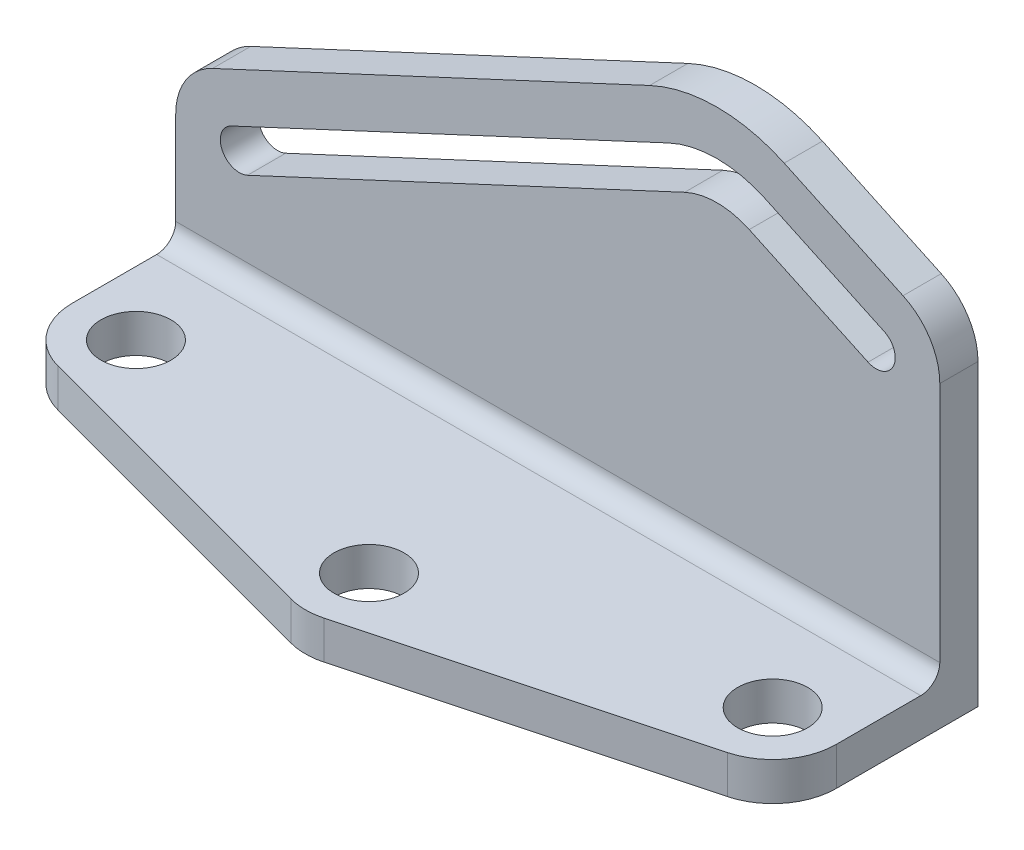
ISO-10303-21;
HEADER;
FILE_DESCRIPTION(('STEP AP214'),'2;1');
FILE_NAME('part.step','',(''),(''),'','','');
FILE_SCHEMA(('AUTOMOTIVE_DESIGN { 1 0 10303 214 1 1 1 1 }'));
ENDSEC;
DATA;
#1=APPLICATION_CONTEXT('core data for automotive mechanical design processes');
#2=APPLICATION_PROTOCOL_DEFINITION('international standard','automotive_design',2000,#1);
#3=PRODUCT_CONTEXT('',#1,'mechanical');
#4=PRODUCT('Part','Part','',(#3));
#5=PRODUCT_RELATED_PRODUCT_CATEGORY('part','',(#4));
#6=PRODUCT_DEFINITION_FORMATION('','',#4);
#7=PRODUCT_DEFINITION_CONTEXT('part definition',#1,'design');
#8=PRODUCT_DEFINITION('design','',#6,#7);
#9=PRODUCT_DEFINITION_SHAPE('','',#8);
#10=(LENGTH_UNIT() NAMED_UNIT(*) SI_UNIT(.MILLI.,.METRE.));
#11=(NAMED_UNIT(*) PLANE_ANGLE_UNIT() SI_UNIT($,.RADIAN.));
#12=(NAMED_UNIT(*) SI_UNIT($,.STERADIAN.) SOLID_ANGLE_UNIT());
#13=UNCERTAINTY_MEASURE_WITH_UNIT(LENGTH_MEASURE(1.E-05),#10,'distance_accuracy_value','');
#14=(GEOMETRIC_REPRESENTATION_CONTEXT(3) GLOBAL_UNCERTAINTY_ASSIGNED_CONTEXT((#13)) GLOBAL_UNIT_ASSIGNED_CONTEXT((#10,
#11,#12)) REPRESENTATION_CONTEXT('',''));
#15=CARTESIAN_POINT('',(0.,0.,0.));
#16=DIRECTION('',(0.,0.,1.));
#17=DIRECTION('',(1.,0.,0.));
#18=AXIS2_PLACEMENT_3D('',#15,#16,#17);
#19=CARTESIAN_POINT('',(60.,0.,6.));
#20=DIRECTION('',(0.,1.,0.));
#21=DIRECTION('',(0.,0.,1.));
#22=AXIS2_PLACEMENT_3D('',#19,#20,#21);
#23=PLANE('',#22);
#24=DIRECTION('',(1.,0.,0.));
#25=VECTOR('',#24,1.);
#26=CARTESIAN_POINT('',(60.,0.,0.));
#27=LINE('',#26,#25);
#28=CARTESIAN_POINT('',(-60.,0.,0.));
#29=VERTEX_POINT('',#28);
#30=CARTESIAN_POINT('',(60.,0.,0.));
#31=VERTEX_POINT('',#30);
#32=EDGE_CURVE('E314',#29,#31,#27,.T.);
#33=ORIENTED_EDGE('',*,*,#32,.T.);
#34=DIRECTION('',(0.,0.,-1.));
#35=VECTOR('',#34,1.);
#36=CARTESIAN_POINT('',(60.,0.,6.));
#37=LINE('',#36,#35);
#38=CARTESIAN_POINT('',(60.,0.,22.249778574343));
#39=VERTEX_POINT('',#38);
#40=EDGE_CURVE('E377',#39,#31,#37,.T.);
#41=ORIENTED_EDGE('',*,*,#40,.F.);
#42=CARTESIAN_POINT('',(50.,0.,22.249778574343));
#43=DIRECTION('',(0.,-1.,0.));
#44=DIRECTION('',(0.,0.,1.));
#45=AXIS2_PLACEMENT_3D('',#42,#43,#44);
#46=CIRCLE('',#45,9.99999999999999);
#47=CARTESIAN_POINT('',(52.5881904510252,0.,31.9090368372337));
#48=VERTEX_POINT('',#47);
#49=EDGE_CURVE('E273',#39,#48,#46,.T.);
#50=ORIENTED_EDGE('',*,*,#49,.T.);
#51=DIRECTION('',(-0.965925826289068,0.,0.258819045102522));
#52=VECTOR('',#51,1.);
#53=CARTESIAN_POINT('',(2.58819045102522,0.,45.3064964587899));
#54=LINE('',#53,#52);
#55=CARTESIAN_POINT('',(2.58819045102522,0.,45.3064964587899));
#56=VERTEX_POINT('',#55);
#57=EDGE_CURVE('E300',#48,#56,#54,.T.);
#58=ORIENTED_EDGE('',*,*,#57,.T.);
#59=CARTESIAN_POINT('',(0.,0.,35.6472381958992));
#60=DIRECTION('',(0.,-1.,0.));
#61=DIRECTION('',(0.,0.,1.));
#62=AXIS2_PLACEMENT_3D('',#59,#60,#61);
#63=CIRCLE('',#62,10.);
#64=CARTESIAN_POINT('',(-2.58819045102521,0.,45.3064964587899));
#65=VERTEX_POINT('',#64);
#66=EDGE_CURVE('E303',#56,#65,#63,.T.);
#67=ORIENTED_EDGE('',*,*,#66,.T.);
#68=DIRECTION('',(-0.965925826289068,0.,-0.258819045102521));
#69=VECTOR('',#68,1.);
#70=CARTESIAN_POINT('',(-52.5881904510252,0.,31.9090368372337));
#71=LINE('',#70,#69);
#72=CARTESIAN_POINT('',(-52.5881904510252,0.,31.9090368372337));
#73=VERTEX_POINT('',#72);
#74=EDGE_CURVE('E306',#65,#73,#71,.T.);
#75=ORIENTED_EDGE('',*,*,#74,.T.);
#76=CARTESIAN_POINT('',(-50.,0.,22.249778574343));
#77=DIRECTION('',(0.,-1.,0.));
#78=DIRECTION('',(0.,0.,1.));
#79=AXIS2_PLACEMENT_3D('',#76,#77,#78);
#80=CIRCLE('',#79,10.);
#81=CARTESIAN_POINT('',(-60.,0.,22.249778574343));
#82=VERTEX_POINT('',#81);
#83=EDGE_CURVE('E280',#73,#82,#80,.T.);
#84=ORIENTED_EDGE('',*,*,#83,.T.);
#85=DIRECTION('',(0.,0.,-1.));
#86=VECTOR('',#85,1.);
#87=CARTESIAN_POINT('',(-60.,0.,6.));
#88=LINE('',#87,#86);
#89=EDGE_CURVE('E341',#82,#29,#88,.T.);
#90=ORIENTED_EDGE('',*,*,#89,.T.);
#91=EDGE_LOOP('',(#33,#41,#50,#58,#67,#75,#84,#90));
#92=FACE_BOUND('',#91,.T.);
#93=CARTESIAN_POINT('',(50.,0.,22.249778574343));
#94=DIRECTION('',(0.,-1.,0.));
#95=DIRECTION('',(0.,0.,-1.));
#96=AXIS2_PLACEMENT_3D('',#93,#94,#95);
#97=CIRCLE('',#96,5.5);
#98=CARTESIAN_POINT('',(50.,0.,16.749778574343));
#99=VERTEX_POINT('',#98);
#100=EDGE_CURVE('E246',#99,#99,#97,.T.);
#101=ORIENTED_EDGE('',*,*,#100,.F.);
#102=EDGE_LOOP('',(#101));
#103=FACE_BOUND('',#102,.T.);
#104=CARTESIAN_POINT('',(0.,0.,35.6472381958992));
#105=DIRECTION('',(0.,-1.,0.));
#106=DIRECTION('',(0.,0.,-1.));
#107=AXIS2_PLACEMENT_3D('',#104,#105,#106);
#108=CIRCLE('',#107,5.50000000000001);
#109=CARTESIAN_POINT('',(0.,0.,30.1472381958992));
#110=VERTEX_POINT('',#109);
#111=EDGE_CURVE('E261',#110,#110,#108,.T.);
#112=ORIENTED_EDGE('',*,*,#111,.F.);
#113=EDGE_LOOP('',(#112));
#114=FACE_BOUND('',#113,.T.);
#115=CARTESIAN_POINT('',(-50.,0.,22.249778574343));
#116=DIRECTION('',(0.,-1.,0.));
#117=DIRECTION('',(0.,0.,-1.));
#118=AXIS2_PLACEMENT_3D('',#115,#116,#117);
#119=CIRCLE('',#118,5.5);
#120=CARTESIAN_POINT('',(-50.,0.,16.749778574343));
#121=VERTEX_POINT('',#120);
#122=EDGE_CURVE('E267',#121,#121,#119,.T.);
#123=ORIENTED_EDGE('',*,*,#122,.F.);
#124=EDGE_LOOP('',(#123));
#125=FACE_BOUND('',#124,.T.);
#126=ADVANCED_FACE('F35',(#92,#103,#114,#125),#23,.F.);
#127=CARTESIAN_POINT('',(60.,46.9446802996746,6.));
#128=DIRECTION('',(-1.,0.,0.));
#129=DIRECTION('',(0.,-1.,0.));
#130=AXIS2_PLACEMENT_3D('',#127,#128,#129);
#131=PLANE('',#130);
#132=DIRECTION('',(0.,1.,0.));
#133=VECTOR('',#132,1.);
#134=CARTESIAN_POINT('',(60.,46.9446802996746,0.));
#135=LINE('',#134,#133);
#136=CARTESIAN_POINT('',(60.,46.9446802996746,0.));
#137=VERTEX_POINT('',#136);
#138=EDGE_CURVE('E344',#31,#137,#135,.T.);
#139=ORIENTED_EDGE('',*,*,#138,.T.);
#140=DIRECTION('',(0.,0.,-1.));
#141=VECTOR('',#140,1.);
#142=CARTESIAN_POINT('',(60.,46.9446802996746,6.));
#143=LINE('',#142,#141);
#144=CARTESIAN_POINT('',(60.,46.9446802996746,6.));
#145=VERTEX_POINT('',#144);
#146=EDGE_CURVE('E374',#145,#137,#143,.T.);
#147=ORIENTED_EDGE('',*,*,#146,.F.);
#148=DIRECTION('',(0.,1.,0.));
#149=VECTOR('',#148,1.);
#150=CARTESIAN_POINT('',(60.,46.9446802996746,6.));
#151=LINE('',#150,#149);
#152=CARTESIAN_POINT('',(60.,9.,6.));
#153=VERTEX_POINT('',#152);
#154=EDGE_CURVE('E325',#153,#145,#151,.T.);
#155=ORIENTED_EDGE('',*,*,#154,.F.);
#156=CARTESIAN_POINT('',(60.,9.,9.));
#157=DIRECTION('',(-1.,0.,0.));
#158=DIRECTION('',(0.,-1.,0.));
#159=AXIS2_PLACEMENT_3D('',#156,#157,#158);
#160=CIRCLE('',#159,3.);
#161=CARTESIAN_POINT('',(60.,6.,9.));
#162=VERTEX_POINT('',#161);
#163=EDGE_CURVE('E43',#153,#162,#160,.T.);
#164=ORIENTED_EDGE('',*,*,#163,.T.);
#165=DIRECTION('',(0.,0.,1.));
#166=VECTOR('',#165,1.);
#167=CARTESIAN_POINT('',(60.,6.,22.249778574343));
#168=LINE('',#167,#166);
#169=CARTESIAN_POINT('',(60.,6.,22.249778574343));
#170=VERTEX_POINT('',#169);
#171=EDGE_CURVE('E279',#162,#170,#168,.T.);
#172=ORIENTED_EDGE('',*,*,#171,.T.);
#173=DIRECTION('',(0.,-1.,0.));
#174=VECTOR('',#173,1.);
#175=CARTESIAN_POINT('',(60.,6.,22.249778574343));
#176=LINE('',#175,#174);
#177=EDGE_CURVE('E297',#170,#39,#176,.T.);
#178=ORIENTED_EDGE('',*,*,#177,.T.);
#179=ORIENTED_EDGE('',*,*,#40,.T.);
#180=EDGE_LOOP('',(#139,#147,#155,#164,#172,#178,#179));
#181=FACE_BOUND('',#180,.T.);
#182=ADVANCED_FACE('F387',(#181),#131,.F.);
#183=CARTESIAN_POINT('',(50.,46.9446802996746,6.));
#184=DIRECTION('',(0.,0.,-1.));
#185=DIRECTION('',(-1.,0.,0.));
#186=AXIS2_PLACEMENT_3D('',#183,#184,#185);
#187=CYLINDRICAL_SURFACE('',#186,9.99999999999999);
#188=CARTESIAN_POINT('',(50.,46.9446802996746,0.));
#189=DIRECTION('',(0.,0.,1.));
#190=DIRECTION('',(-1.,0.,0.));
#191=AXIS2_PLACEMENT_3D('',#188,#189,#190);
#192=CIRCLE('',#191,9.99999999999999);
#193=CARTESIAN_POINT('',(54.226182617407,56.007758170041,0.));
#194=VERTEX_POINT('',#193);
#195=EDGE_CURVE('E346',#137,#194,#192,.T.);
#196=ORIENTED_EDGE('',*,*,#195,.T.);
#197=DIRECTION('',(0.,0.,-1.));
#198=VECTOR('',#197,1.);
#199=CARTESIAN_POINT('',(54.226182617407,56.007758170041,6.));
#200=LINE('',#199,#198);
#201=CARTESIAN_POINT('',(54.226182617407,56.007758170041,6.));
#202=VERTEX_POINT('',#201);
#203=EDGE_CURVE('E371',#202,#194,#200,.T.);
#204=ORIENTED_EDGE('',*,*,#203,.F.);
#205=CARTESIAN_POINT('',(50.,46.9446802996746,6.));
#206=DIRECTION('',(0.,0.,1.));
#207=DIRECTION('',(-1.,0.,0.));
#208=AXIS2_PLACEMENT_3D('',#205,#206,#207);
#209=CIRCLE('',#208,9.99999999999999);
#210=EDGE_CURVE('E327',#145,#202,#209,.T.);
#211=ORIENTED_EDGE('',*,*,#210,.F.);
#212=ORIENTED_EDGE('',*,*,#146,.T.);
#213=EDGE_LOOP('',(#196,#204,#211,#212));
#214=FACE_BOUND('',#213,.T.);
#215=ADVANCED_FACE('F436',(#214),#187,.T.);
#216=CARTESIAN_POINT('',(35.5654565435175,64.7093976450285,6.));
#217=DIRECTION('',(-0.422618261740703,-0.906307787036648,0.));
#218=DIRECTION('',(0.906307787036648,-0.422618261740704,0.));
#219=AXIS2_PLACEMENT_3D('',#216,#217,#218);
#220=PLANE('',#219);
#221=DIRECTION('',(-0.906307787036648,0.422618261740704,0.));
#222=VECTOR('',#221,1.);
#223=CARTESIAN_POINT('',(35.5654565435175,64.7093976450285,0.));
#224=LINE('',#223,#222);
#225=CARTESIAN_POINT('',(35.5654565435175,64.7093976450285,0.));
#226=VERTEX_POINT('',#225);
#227=EDGE_CURVE('E348',#194,#226,#224,.T.);
#228=ORIENTED_EDGE('',*,*,#227,.T.);
#229=DIRECTION('',(0.,0.,-1.));
#230=VECTOR('',#229,1.);
#231=CARTESIAN_POINT('',(35.5654565435175,64.7093976450285,6.));
#232=LINE('',#231,#230);
#233=CARTESIAN_POINT('',(35.5654565435175,64.7093976450285,6.));
#234=VERTEX_POINT('',#233);
#235=EDGE_CURVE('E368',#234,#226,#232,.T.);
#236=ORIENTED_EDGE('',*,*,#235,.F.);
#237=DIRECTION('',(-0.906307787036648,0.422618261740704,0.));
#238=VECTOR('',#237,1.);
#239=CARTESIAN_POINT('',(35.5654565435175,64.7093976450285,6.));
#240=LINE('',#239,#238);
#241=EDGE_CURVE('E330',#202,#234,#240,.T.);
#242=ORIENTED_EDGE('',*,*,#241,.F.);
#243=ORIENTED_EDGE('',*,*,#203,.T.);
#244=EDGE_LOOP('',(#228,#236,#242,#243));
#245=FACE_BOUND('',#244,.T.);
#246=ADVANCED_FACE('F442',(#245),#220,.F.);
#247=CARTESIAN_POINT('',(24.9999999999999,42.0517029691123,6.));
#248=DIRECTION('',(0.,0.,-1.));
#249=DIRECTION('',(-1.,0.,0.));
#250=AXIS2_PLACEMENT_3D('',#247,#248,#249);
#251=CYLINDRICAL_SURFACE('',#250,25.);
#252=CARTESIAN_POINT('',(24.9999999999999,42.0517029691123,0.));
#253=DIRECTION('',(0.,0.,1.));
#254=DIRECTION('',(-1.,0.,0.));
#255=AXIS2_PLACEMENT_3D('',#252,#253,#254);
#256=CIRCLE('',#255,25.);
#257=CARTESIAN_POINT('',(14.4345434564825,64.7093976450285,0.));
#258=VERTEX_POINT('',#257);
#259=EDGE_CURVE('E350',#226,#258,#256,.T.);
#260=ORIENTED_EDGE('',*,*,#259,.T.);
#261=DIRECTION('',(0.,0.,-1.));
#262=VECTOR('',#261,1.);
#263=CARTESIAN_POINT('',(14.4345434564825,64.7093976450285,6.));
#264=LINE('',#263,#262);
#265=CARTESIAN_POINT('',(14.4345434564825,64.7093976450285,6.));
#266=VERTEX_POINT('',#265);
#267=EDGE_CURVE('E365',#266,#258,#264,.T.);
#268=ORIENTED_EDGE('',*,*,#267,.F.);
#269=CARTESIAN_POINT('',(24.9999999999999,42.0517029691123,6.));
#270=DIRECTION('',(0.,0.,1.));
#271=DIRECTION('',(-1.,0.,0.));
#272=AXIS2_PLACEMENT_3D('',#269,#270,#271);
#273=CIRCLE('',#272,25.);
#274=EDGE_CURVE('E332',#234,#266,#273,.T.);
#275=ORIENTED_EDGE('',*,*,#274,.F.);
#276=ORIENTED_EDGE('',*,*,#235,.T.);
#277=EDGE_LOOP('',(#260,#268,#275,#276));
#278=FACE_BOUND('',#277,.T.);
#279=ADVANCED_FACE('F446',(#278),#251,.T.);
#280=CARTESIAN_POINT('',(-54.226182617407,32.6923752622915,6.));
#281=DIRECTION('',(0.422618261740697,-0.906307787036651,0.));
#282=DIRECTION('',(0.906307787036651,0.422618261740697,0.));
#283=AXIS2_PLACEMENT_3D('',#280,#281,#282);
#284=PLANE('',#283);
#285=DIRECTION('',(-0.906307787036651,-0.422618261740697,0.));
#286=VECTOR('',#285,1.);
#287=CARTESIAN_POINT('',(-54.226182617407,32.6923752622915,0.));
#288=LINE('',#287,#286);
#289=CARTESIAN_POINT('',(-54.226182617407,32.6923752622915,0.));
#290=VERTEX_POINT('',#289);
#291=EDGE_CURVE('E352',#258,#290,#288,.T.);
#292=ORIENTED_EDGE('',*,*,#291,.T.);
#293=DIRECTION('',(0.,0.,-1.));
#294=VECTOR('',#293,1.);
#295=CARTESIAN_POINT('',(-54.226182617407,32.6923752622915,6.));
#296=LINE('',#295,#294);
#297=CARTESIAN_POINT('',(-54.226182617407,32.6923752622915,6.));
#298=VERTEX_POINT('',#297);
#299=EDGE_CURVE('E362',#298,#290,#296,.T.);
#300=ORIENTED_EDGE('',*,*,#299,.F.);
#301=DIRECTION('',(-0.906307787036651,-0.422618261740697,0.));
#302=VECTOR('',#301,1.);
#303=CARTESIAN_POINT('',(-54.226182617407,32.6923752622915,6.));
#304=LINE('',#303,#302);
#305=EDGE_CURVE('E334',#266,#298,#304,.T.);
#306=ORIENTED_EDGE('',*,*,#305,.F.);
#307=ORIENTED_EDGE('',*,*,#267,.T.);
#308=EDGE_LOOP('',(#292,#300,#306,#307));
#309=FACE_BOUND('',#308,.T.);
#310=ADVANCED_FACE('F449',(#309),#284,.F.);
#311=CARTESIAN_POINT('',(-50.,23.629297391925,6.));
#312=DIRECTION('',(0.,0.,-1.));
#313=DIRECTION('',(-1.,0.,0.));
#314=AXIS2_PLACEMENT_3D('',#311,#312,#313);
#315=CYLINDRICAL_SURFACE('',#314,10.);
#316=CARTESIAN_POINT('',(-50.,23.629297391925,0.));
#317=DIRECTION('',(0.,0.,1.));
#318=DIRECTION('',(-1.,0.,0.));
#319=AXIS2_PLACEMENT_3D('',#316,#317,#318);
#320=CIRCLE('',#319,10.);
#321=CARTESIAN_POINT('',(-60.,23.629297391925,0.));
#322=VERTEX_POINT('',#321);
#323=EDGE_CURVE('E354',#290,#322,#320,.T.);
#324=ORIENTED_EDGE('',*,*,#323,.T.);
#325=DIRECTION('',(0.,0.,-1.));
#326=VECTOR('',#325,1.);
#327=CARTESIAN_POINT('',(-60.,23.629297391925,6.));
#328=LINE('',#327,#326);
#329=CARTESIAN_POINT('',(-60.,23.629297391925,6.));
#330=VERTEX_POINT('',#329);
#331=EDGE_CURVE('E359',#330,#322,#328,.T.);
#332=ORIENTED_EDGE('',*,*,#331,.F.);
#333=CARTESIAN_POINT('',(-50.,23.629297391925,6.));
#334=DIRECTION('',(0.,0.,1.));
#335=DIRECTION('',(-1.,0.,0.));
#336=AXIS2_PLACEMENT_3D('',#333,#334,#335);
#337=CIRCLE('',#336,10.);
#338=EDGE_CURVE('E336',#298,#330,#337,.T.);
#339=ORIENTED_EDGE('',*,*,#338,.F.);
#340=ORIENTED_EDGE('',*,*,#299,.T.);
#341=EDGE_LOOP('',(#324,#332,#339,#340));
#342=FACE_BOUND('',#341,.T.);
#343=ADVANCED_FACE('F409',(#342),#315,.T.);
#344=CARTESIAN_POINT('',(-60.,0.,6.));
#345=DIRECTION('',(1.,0.,0.));
#346=DIRECTION('',(0.,0.,-1.));
#347=AXIS2_PLACEMENT_3D('',#344,#345,#346);
#348=PLANE('',#347);
#349=DIRECTION('',(0.,-1.,0.));
#350=VECTOR('',#349,1.);
#351=CARTESIAN_POINT('',(-60.,0.,0.));
#352=LINE('',#351,#350);
#353=EDGE_CURVE('E328',#322,#29,#352,.T.);
#354=ORIENTED_EDGE('',*,*,#353,.T.);
#355=ORIENTED_EDGE('',*,*,#89,.F.);
#356=DIRECTION('',(0.,-1.,0.));
#357=VECTOR('',#356,1.);
#358=CARTESIAN_POINT('',(-60.,6.,22.249778574343));
#359=LINE('',#358,#357);
#360=CARTESIAN_POINT('',(-60.,6.,22.249778574343));
#361=VERTEX_POINT('',#360);
#362=EDGE_CURVE('E311',#361,#82,#359,.T.);
#363=ORIENTED_EDGE('',*,*,#362,.F.);
#364=DIRECTION('',(0.,0.,-1.));
#365=VECTOR('',#364,1.);
#366=CARTESIAN_POINT('',(-60.,6.,6.));
#367=LINE('',#366,#365);
#368=CARTESIAN_POINT('',(-60.,6.,9.));
#369=VERTEX_POINT('',#368);
#370=EDGE_CURVE('E276',#361,#369,#367,.T.);
#371=ORIENTED_EDGE('',*,*,#370,.T.);
#372=CARTESIAN_POINT('',(-60.,9.,9.));
#373=DIRECTION('',(1.,0.,0.));
#374=DIRECTION('',(0.,0.,-1.));
#375=AXIS2_PLACEMENT_3D('',#372,#373,#374);
#376=CIRCLE('',#375,3.);
#377=CARTESIAN_POINT('',(-60.,9.,6.));
#378=VERTEX_POINT('',#377);
#379=EDGE_CURVE('E11',#369,#378,#376,.T.);
#380=ORIENTED_EDGE('',*,*,#379,.T.);
#381=DIRECTION('',(0.,-1.,0.));
#382=VECTOR('',#381,1.);
#383=CARTESIAN_POINT('',(-60.,0.,6.));
#384=LINE('',#383,#382);
#385=EDGE_CURVE('E338',#330,#378,#384,.T.);
#386=ORIENTED_EDGE('',*,*,#385,.F.);
#387=ORIENTED_EDGE('',*,*,#331,.T.);
#388=EDGE_LOOP('',(#354,#355,#363,#371,#380,#386,#387));
#389=FACE_BOUND('',#388,.T.);
#390=ADVANCED_FACE('F401',(#389),#348,.F.);
#391=CARTESIAN_POINT('',(-50.,23.629297391925,6.));
#392=DIRECTION('',(0.,0.,-1.));
#393=DIRECTION('',(-1.,0.,0.));
#394=AXIS2_PLACEMENT_3D('',#391,#392,#393);
#395=PLANE('',#394);
#396=DIRECTION('',(-0.906307787036648,0.422618261740703,0.));
#397=VECTOR('',#396,1.);
#398=CARTESIAN_POINT('',(51.2678547852221,49.6636036607845,6.));
#399=LINE('',#398,#397);
#400=CARTESIAN_POINT('',(51.2678547852221,49.6636036607845,6.));
#401=VERTEX_POINT('',#400);
#402=CARTESIAN_POINT('',(32.6071287113325,58.3652431357719,6.));
#403=VERTEX_POINT('',#402);
#404=EDGE_CURVE('E228',#401,#403,#399,.T.);
#405=ORIENTED_EDGE('',*,*,#404,.F.);
#406=CARTESIAN_POINT('',(50.,46.9446802996745,6.));
#407=DIRECTION('',(0.,0.,1.));
#408=DIRECTION('',(-1.,0.,0.));
#409=AXIS2_PLACEMENT_3D('',#406,#407,#408);
#410=CIRCLE('',#409,3.);
#411=CARTESIAN_POINT('',(48.7321452147779,44.2257569385646,6.));
#412=VERTEX_POINT('',#411);
#413=EDGE_CURVE('E50',#412,#401,#410,.T.);
#414=ORIENTED_EDGE('',*,*,#413,.F.);
#415=DIRECTION('',(0.906307787036648,-0.422618261740703,0.));
#416=VECTOR('',#415,1.);
#417=CARTESIAN_POINT('',(48.7321452147779,44.2257569385646,6.));
#418=LINE('',#417,#416);
#419=CARTESIAN_POINT('',(30.0714191408883,52.9273964135521,6.));
#420=VERTEX_POINT('',#419);
#421=EDGE_CURVE('E208',#420,#412,#418,.T.);
#422=ORIENTED_EDGE('',*,*,#421,.F.);
#423=CARTESIAN_POINT('',(24.9999999999999,42.0517029691123,6.));
#424=DIRECTION('',(0.,0.,-1.));
#425=DIRECTION('',(1.,0.,0.));
#426=AXIS2_PLACEMENT_3D('',#423,#424,#425);
#427=CIRCLE('',#426,12.);
#428=CARTESIAN_POINT('',(19.9285808591115,52.9273964135521,6.));
#429=VERTEX_POINT('',#428);
#430=EDGE_CURVE('E211',#429,#420,#427,.T.);
#431=ORIENTED_EDGE('',*,*,#430,.F.);
#432=DIRECTION('',(0.906307787036651,0.422618261740697,0.));
#433=VECTOR('',#432,1.);
#434=CARTESIAN_POINT('',(19.9285808591115,52.9273964135521,6.));
#435=LINE('',#434,#433);
#436=CARTESIAN_POINT('',(-48.7321452147779,20.9103740308151,6.));
#437=VERTEX_POINT('',#436);
#438=EDGE_CURVE('E239',#437,#429,#435,.T.);
#439=ORIENTED_EDGE('',*,*,#438,.F.);
#440=CARTESIAN_POINT('',(-50.,23.629297391925,6.));
#441=DIRECTION('',(0.,0.,1.));
#442=DIRECTION('',(1.,0.,0.));
#443=AXIS2_PLACEMENT_3D('',#440,#441,#442);
#444=CIRCLE('',#443,3.);
#445=CARTESIAN_POINT('',(-51.2678547852221,26.348220753035,6.));
#446=VERTEX_POINT('',#445);
#447=EDGE_CURVE('E236',#446,#437,#444,.T.);
#448=ORIENTED_EDGE('',*,*,#447,.F.);
#449=DIRECTION('',(-0.906307787036651,-0.422618261740697,0.));
#450=VECTOR('',#449,1.);
#451=CARTESIAN_POINT('',(17.3928712886673,58.365243135772,6.));
#452=LINE('',#451,#450);
#453=CARTESIAN_POINT('',(17.3928712886673,58.365243135772,6.));
#454=VERTEX_POINT('',#453);
#455=EDGE_CURVE('E233',#454,#446,#452,.T.);
#456=ORIENTED_EDGE('',*,*,#455,.F.);
#457=CARTESIAN_POINT('',(24.9999999999999,42.0517029691123,6.));
#458=DIRECTION('',(0.,0.,1.));
#459=DIRECTION('',(1.,0.,0.));
#460=AXIS2_PLACEMENT_3D('',#457,#458,#459);
#461=CIRCLE('',#460,18.);
#462=EDGE_CURVE('E230',#403,#454,#461,.T.);
#463=ORIENTED_EDGE('',*,*,#462,.F.);
#464=EDGE_LOOP('',(#405,#414,#422,#431,#439,#448,#456,#463));
#465=FACE_BOUND('',#464,.T.);
#466=ORIENTED_EDGE('',*,*,#385,.T.);
#467=DIRECTION('',(1.,0.,0.));
#468=VECTOR('',#467,1.);
#469=CARTESIAN_POINT('',(-50.,9.,6.));
#470=LINE('',#469,#468);
#471=EDGE_CURVE('E380',#378,#153,#470,.T.);
#472=ORIENTED_EDGE('',*,*,#471,.T.);
#473=ORIENTED_EDGE('',*,*,#154,.T.);
#474=ORIENTED_EDGE('',*,*,#210,.T.);
#475=ORIENTED_EDGE('',*,*,#241,.T.);
#476=ORIENTED_EDGE('',*,*,#274,.T.);
#477=ORIENTED_EDGE('',*,*,#305,.T.);
#478=ORIENTED_EDGE('',*,*,#338,.T.);
#479=EDGE_LOOP('',(#466,#472,#473,#474,#475,#476,#477,#478));
#480=FACE_BOUND('',#479,.T.);
#481=ADVANCED_FACE('F403',(#465,#480),#395,.F.);
#482=CARTESIAN_POINT('',(-50.,23.629297391925,0.));
#483=DIRECTION('',(0.,0.,-1.));
#484=DIRECTION('',(-1.,0.,0.));
#485=AXIS2_PLACEMENT_3D('',#482,#483,#484);
#486=PLANE('',#485);
#487=CARTESIAN_POINT('',(50.,46.9446802996745,0.));
#488=DIRECTION('',(0.,0.,1.));
#489=DIRECTION('',(-1.,0.,0.));
#490=AXIS2_PLACEMENT_3D('',#487,#488,#489);
#491=CIRCLE('',#490,3.);
#492=CARTESIAN_POINT('',(48.7321452147779,44.2257569385646,0.));
#493=VERTEX_POINT('',#492);
#494=CARTESIAN_POINT('',(51.2678547852221,49.6636036607845,0.));
#495=VERTEX_POINT('',#494);
#496=EDGE_CURVE('E191',#493,#495,#491,.T.);
#497=ORIENTED_EDGE('',*,*,#496,.T.);
#498=DIRECTION('',(-0.906307787036648,0.422618261740703,0.));
#499=VECTOR('',#498,1.);
#500=CARTESIAN_POINT('',(51.2678547852221,49.6636036607845,0.));
#501=LINE('',#500,#499);
#502=CARTESIAN_POINT('',(32.6071287113325,58.3652431357719,0.));
#503=VERTEX_POINT('',#502);
#504=EDGE_CURVE('E200',#495,#503,#501,.T.);
#505=ORIENTED_EDGE('',*,*,#504,.T.);
#506=CARTESIAN_POINT('',(24.9999999999999,42.0517029691123,0.));
#507=DIRECTION('',(0.,0.,1.));
#508=DIRECTION('',(1.,0.,0.));
#509=AXIS2_PLACEMENT_3D('',#506,#507,#508);
#510=CIRCLE('',#509,18.);
#511=CARTESIAN_POINT('',(17.3928712886673,58.365243135772,0.));
#512=VERTEX_POINT('',#511);
#513=EDGE_CURVE('E58',#503,#512,#510,.T.);
#514=ORIENTED_EDGE('',*,*,#513,.T.);
#515=DIRECTION('',(-0.906307787036651,-0.422618261740697,0.));
#516=VECTOR('',#515,1.);
#517=CARTESIAN_POINT('',(17.3928712886673,58.365243135772,0.));
#518=LINE('',#517,#516);
#519=CARTESIAN_POINT('',(-51.2678547852221,26.348220753035,0.));
#520=VERTEX_POINT('',#519);
#521=EDGE_CURVE('E215',#512,#520,#518,.T.);
#522=ORIENTED_EDGE('',*,*,#521,.T.);
#523=CARTESIAN_POINT('',(-50.,23.629297391925,0.));
#524=DIRECTION('',(0.,0.,1.));
#525=DIRECTION('',(1.,0.,0.));
#526=AXIS2_PLACEMENT_3D('',#523,#524,#525);
#527=CIRCLE('',#526,3.);
#528=CARTESIAN_POINT('',(-48.7321452147779,20.9103740308151,0.));
#529=VERTEX_POINT('',#528);
#530=EDGE_CURVE('E218',#520,#529,#527,.T.);
#531=ORIENTED_EDGE('',*,*,#530,.T.);
#532=DIRECTION('',(0.906307787036651,0.422618261740697,0.));
#533=VECTOR('',#532,1.);
#534=CARTESIAN_POINT('',(19.9285808591115,52.9273964135521,0.));
#535=LINE('',#534,#533);
#536=CARTESIAN_POINT('',(19.9285808591115,52.9273964135521,0.));
#537=VERTEX_POINT('',#536);
#538=EDGE_CURVE('E221',#529,#537,#535,.T.);
#539=ORIENTED_EDGE('',*,*,#538,.T.);
#540=CARTESIAN_POINT('',(24.9999999999999,42.0517029691123,0.));
#541=DIRECTION('',(0.,0.,-1.));
#542=DIRECTION('',(1.,0.,0.));
#543=AXIS2_PLACEMENT_3D('',#540,#541,#542);
#544=CIRCLE('',#543,12.);
#545=CARTESIAN_POINT('',(30.0714191408883,52.9273964135521,0.));
#546=VERTEX_POINT('',#545);
#547=EDGE_CURVE('E224',#537,#546,#544,.T.);
#548=ORIENTED_EDGE('',*,*,#547,.T.);
#549=DIRECTION('',(0.906307787036648,-0.422618261740703,0.));
#550=VECTOR('',#549,1.);
#551=CARTESIAN_POINT('',(48.7321452147779,44.2257569385646,0.));
#552=LINE('',#551,#550);
#553=EDGE_CURVE('E197',#546,#493,#552,.T.);
#554=ORIENTED_EDGE('',*,*,#553,.T.);
#555=EDGE_LOOP('',(#497,#505,#514,#522,#531,#539,#548,#554));
#556=FACE_BOUND('',#555,.T.);
#557=ORIENTED_EDGE('',*,*,#32,.F.);
#558=ORIENTED_EDGE('',*,*,#353,.F.);
#559=ORIENTED_EDGE('',*,*,#323,.F.);
#560=ORIENTED_EDGE('',*,*,#291,.F.);
#561=ORIENTED_EDGE('',*,*,#259,.F.);
#562=ORIENTED_EDGE('',*,*,#227,.F.);
#563=ORIENTED_EDGE('',*,*,#195,.F.);
#564=ORIENTED_EDGE('',*,*,#138,.F.);
#565=EDGE_LOOP('',(#557,#558,#559,#560,#561,#562,#563,#564));
#566=FACE_BOUND('',#565,.T.);
#567=ADVANCED_FACE('F204',(#556,#566),#486,.T.);
#568=CARTESIAN_POINT('',(-50.,6.,22.249778574343));
#569=DIRECTION('',(0.,-1.,0.));
#570=DIRECTION('',(0.,0.,-1.));
#571=AXIS2_PLACEMENT_3D('',#568,#569,#570);
#572=CYLINDRICAL_SURFACE('',#571,10.);
#573=ORIENTED_EDGE('',*,*,#83,.F.);
#574=DIRECTION('',(0.,-1.,0.));
#575=VECTOR('',#574,1.);
#576=CARTESIAN_POINT('',(-52.5881904510252,6.,31.9090368372337));
#577=LINE('',#576,#575);
#578=CARTESIAN_POINT('',(-52.5881904510252,6.,31.9090368372337));
#579=VERTEX_POINT('',#578);
#580=EDGE_CURVE('E315',#579,#73,#577,.T.);
#581=ORIENTED_EDGE('',*,*,#580,.F.);
#582=CARTESIAN_POINT('',(-50.,6.,22.249778574343));
#583=DIRECTION('',(0.,-1.,0.));
#584=DIRECTION('',(0.,0.,1.));
#585=AXIS2_PLACEMENT_3D('',#582,#583,#584);
#586=CIRCLE('',#585,10.);
#587=EDGE_CURVE('E294',#579,#361,#586,.T.);
#588=ORIENTED_EDGE('',*,*,#587,.T.);
#589=ORIENTED_EDGE('',*,*,#362,.T.);
#590=EDGE_LOOP('',(#573,#581,#588,#589));
#591=FACE_BOUND('',#590,.T.);
#592=ADVANCED_FACE('F419',(#591),#572,.T.);
#593=CARTESIAN_POINT('',(-52.5881904510252,6.,31.9090368372337));
#594=DIRECTION('',(-0.258819045102521,0.,0.965925826289068));
#595=DIRECTION('',(0.965925826289068,0.,0.258819045102521));
#596=AXIS2_PLACEMENT_3D('',#593,#594,#595);
#597=PLANE('',#596);
#598=ORIENTED_EDGE('',*,*,#74,.F.);
#599=DIRECTION('',(0.,-1.,0.));
#600=VECTOR('',#599,1.);
#601=CARTESIAN_POINT('',(-2.58819045102521,6.,45.3064964587899));
#602=LINE('',#601,#600);
#603=CARTESIAN_POINT('',(-2.58819045102521,6.,45.3064964587899));
#604=VERTEX_POINT('',#603);
#605=EDGE_CURVE('E317',#604,#65,#602,.T.);
#606=ORIENTED_EDGE('',*,*,#605,.F.);
#607=DIRECTION('',(-0.965925826289068,0.,-0.258819045102521));
#608=VECTOR('',#607,1.);
#609=CARTESIAN_POINT('',(-52.5881904510252,6.,31.9090368372337));
#610=LINE('',#609,#608);
#611=EDGE_CURVE('E291',#604,#579,#610,.T.);
#612=ORIENTED_EDGE('',*,*,#611,.T.);
#613=ORIENTED_EDGE('',*,*,#580,.T.);
#614=EDGE_LOOP('',(#598,#606,#612,#613));
#615=FACE_BOUND('',#614,.T.);
#616=ADVANCED_FACE('F503',(#615),#597,.T.);
#617=CARTESIAN_POINT('',(0.,6.,35.6472381958992));
#618=DIRECTION('',(0.,-1.,0.));
#619=DIRECTION('',(0.,0.,-1.));
#620=AXIS2_PLACEMENT_3D('',#617,#618,#619);
#621=CYLINDRICAL_SURFACE('',#620,10.);
#622=ORIENTED_EDGE('',*,*,#66,.F.);
#623=DIRECTION('',(0.,-1.,0.));
#624=VECTOR('',#623,1.);
#625=CARTESIAN_POINT('',(2.58819045102522,6.,45.3064964587899));
#626=LINE('',#625,#624);
#627=CARTESIAN_POINT('',(2.58819045102522,6.,45.3064964587899));
#628=VERTEX_POINT('',#627);
#629=EDGE_CURVE('E319',#628,#56,#626,.T.);
#630=ORIENTED_EDGE('',*,*,#629,.F.);
#631=CARTESIAN_POINT('',(0.,6.,35.6472381958992));
#632=DIRECTION('',(0.,-1.,0.));
#633=DIRECTION('',(0.,0.,1.));
#634=AXIS2_PLACEMENT_3D('',#631,#632,#633);
#635=CIRCLE('',#634,10.);
#636=EDGE_CURVE('E288',#628,#604,#635,.T.);
#637=ORIENTED_EDGE('',*,*,#636,.T.);
#638=ORIENTED_EDGE('',*,*,#605,.T.);
#639=EDGE_LOOP('',(#622,#630,#637,#638));
#640=FACE_BOUND('',#639,.T.);
#641=ADVANCED_FACE('F426',(#640),#621,.T.);
#642=CARTESIAN_POINT('',(2.58819045102522,6.,45.3064964587899));
#643=DIRECTION('',(0.258819045102522,0.,0.965925826289068));
#644=DIRECTION('',(0.965925826289068,0.,-0.258819045102522));
#645=AXIS2_PLACEMENT_3D('',#642,#643,#644);
#646=PLANE('',#645);
#647=ORIENTED_EDGE('',*,*,#57,.F.);
#648=DIRECTION('',(0.,-1.,0.));
#649=VECTOR('',#648,1.);
#650=CARTESIAN_POINT('',(52.5881904510252,6.,31.9090368372337));
#651=LINE('',#650,#649);
#652=CARTESIAN_POINT('',(52.5881904510252,6.,31.9090368372337));
#653=VERTEX_POINT('',#652);
#654=EDGE_CURVE('E321',#653,#48,#651,.T.);
#655=ORIENTED_EDGE('',*,*,#654,.F.);
#656=DIRECTION('',(-0.965925826289068,0.,0.258819045102522));
#657=VECTOR('',#656,1.);
#658=CARTESIAN_POINT('',(2.58819045102522,6.,45.3064964587899));
#659=LINE('',#658,#657);
#660=EDGE_CURVE('E285',#653,#628,#659,.T.);
#661=ORIENTED_EDGE('',*,*,#660,.T.);
#662=ORIENTED_EDGE('',*,*,#629,.T.);
#663=EDGE_LOOP('',(#647,#655,#661,#662));
#664=FACE_BOUND('',#663,.T.);
#665=ADVANCED_FACE('F430',(#664),#646,.T.);
#666=CARTESIAN_POINT('',(50.,6.,22.249778574343));
#667=DIRECTION('',(0.,-1.,0.));
#668=DIRECTION('',(0.,0.,-1.));
#669=AXIS2_PLACEMENT_3D('',#666,#667,#668);
#670=CYLINDRICAL_SURFACE('',#669,9.99999999999999);
#671=ORIENTED_EDGE('',*,*,#49,.F.);
#672=ORIENTED_EDGE('',*,*,#177,.F.);
#673=CARTESIAN_POINT('',(50.,6.,22.249778574343));
#674=DIRECTION('',(0.,-1.,0.));
#675=DIRECTION('',(0.,0.,1.));
#676=AXIS2_PLACEMENT_3D('',#673,#674,#675);
#677=CIRCLE('',#676,9.99999999999999);
#678=EDGE_CURVE('E282',#170,#653,#677,.T.);
#679=ORIENTED_EDGE('',*,*,#678,.T.);
#680=ORIENTED_EDGE('',*,*,#654,.T.);
#681=EDGE_LOOP('',(#671,#672,#679,#680));
#682=FACE_BOUND('',#681,.T.);
#683=ADVANCED_FACE('F433',(#682),#670,.T.);
#684=CARTESIAN_POINT('',(-50.,6.,22.249778574343));
#685=DIRECTION('',(0.,1.,0.));
#686=DIRECTION('',(0.,0.,1.));
#687=AXIS2_PLACEMENT_3D('',#684,#685,#686);
#688=PLANE('',#687);
#689=CARTESIAN_POINT('',(50.,6.,22.249778574343));
#690=DIRECTION('',(0.,-1.,0.));
#691=DIRECTION('',(0.,0.,-1.));
#692=AXIS2_PLACEMENT_3D('',#689,#690,#691);
#693=CIRCLE('',#692,5.5);
#694=CARTESIAN_POINT('',(50.,6.,16.749778574343));
#695=VERTEX_POINT('',#694);
#696=EDGE_CURVE('E258',#695,#695,#693,.T.);
#697=ORIENTED_EDGE('',*,*,#696,.T.);
#698=EDGE_LOOP('',(#697));
#699=FACE_BOUND('',#698,.T.);
#700=CARTESIAN_POINT('',(0.,6.,35.6472381958992));
#701=DIRECTION('',(0.,-1.,0.));
#702=DIRECTION('',(0.,0.,-1.));
#703=AXIS2_PLACEMENT_3D('',#700,#701,#702);
#704=CIRCLE('',#703,5.50000000000001);
#705=CARTESIAN_POINT('',(0.,6.,30.1472381958992));
#706=VERTEX_POINT('',#705);
#707=EDGE_CURVE('E264',#706,#706,#704,.T.);
#708=ORIENTED_EDGE('',*,*,#707,.T.);
#709=EDGE_LOOP('',(#708));
#710=FACE_BOUND('',#709,.T.);
#711=CARTESIAN_POINT('',(-50.,6.,22.249778574343));
#712=DIRECTION('',(0.,-1.,0.));
#713=DIRECTION('',(0.,0.,-1.));
#714=AXIS2_PLACEMENT_3D('',#711,#712,#713);
#715=CIRCLE('',#714,5.5);
#716=CARTESIAN_POINT('',(-50.,6.,16.749778574343));
#717=VERTEX_POINT('',#716);
#718=EDGE_CURVE('E270',#717,#717,#715,.T.);
#719=ORIENTED_EDGE('',*,*,#718,.T.);
#720=EDGE_LOOP('',(#719));
#721=FACE_BOUND('',#720,.T.);
#722=ORIENTED_EDGE('',*,*,#171,.F.);
#723=DIRECTION('',(1.,0.,0.));
#724=VECTOR('',#723,1.);
#725=CARTESIAN_POINT('',(-50.,6.,9.));
#726=LINE('',#725,#724);
#727=EDGE_CURVE('E383',#162,#369,#726,.F.);
#728=ORIENTED_EDGE('',*,*,#727,.T.);
#729=ORIENTED_EDGE('',*,*,#370,.F.);
#730=ORIENTED_EDGE('',*,*,#587,.F.);
#731=ORIENTED_EDGE('',*,*,#611,.F.);
#732=ORIENTED_EDGE('',*,*,#636,.F.);
#733=ORIENTED_EDGE('',*,*,#660,.F.);
#734=ORIENTED_EDGE('',*,*,#678,.F.);
#735=EDGE_LOOP('',(#722,#728,#729,#730,#731,#732,#733,#734));
#736=FACE_BOUND('',#735,.T.);
#737=ADVANCED_FACE('F395',(#699,#710,#721,#736),#688,.T.);
#738=CARTESIAN_POINT('',(-50.,6.,22.249778574343));
#739=DIRECTION('',(0.,-1.,0.));
#740=DIRECTION('',(0.,0.,-1.));
#741=AXIS2_PLACEMENT_3D('',#738,#739,#740);
#742=CYLINDRICAL_SURFACE('',#741,5.5);
#743=ORIENTED_EDGE('',*,*,#718,.F.);
#744=EDGE_LOOP('',(#743));
#745=FACE_BOUND('',#744,.T.);
#746=ORIENTED_EDGE('',*,*,#122,.T.);
#747=EDGE_LOOP('',(#746));
#748=FACE_BOUND('',#747,.T.);
#749=ADVANCED_FACE('F544',(#745,#748),#742,.F.);
#750=CARTESIAN_POINT('',(0.,6.,35.6472381958992));
#751=DIRECTION('',(0.,-1.,0.));
#752=DIRECTION('',(0.,0.,-1.));
#753=AXIS2_PLACEMENT_3D('',#750,#751,#752);
#754=CYLINDRICAL_SURFACE('',#753,5.50000000000001);
#755=ORIENTED_EDGE('',*,*,#707,.F.);
#756=EDGE_LOOP('',(#755));
#757=FACE_BOUND('',#756,.T.);
#758=ORIENTED_EDGE('',*,*,#111,.T.);
#759=EDGE_LOOP('',(#758));
#760=FACE_BOUND('',#759,.T.);
#761=ADVANCED_FACE('F549',(#757,#760),#754,.F.);
#762=CARTESIAN_POINT('',(50.,6.,22.249778574343));
#763=DIRECTION('',(0.,-1.,0.));
#764=DIRECTION('',(0.,0.,-1.));
#765=AXIS2_PLACEMENT_3D('',#762,#763,#764);
#766=CYLINDRICAL_SURFACE('',#765,5.5);
#767=ORIENTED_EDGE('',*,*,#696,.F.);
#768=EDGE_LOOP('',(#767));
#769=FACE_BOUND('',#768,.T.);
#770=ORIENTED_EDGE('',*,*,#100,.T.);
#771=EDGE_LOOP('',(#770));
#772=FACE_BOUND('',#771,.T.);
#773=ADVANCED_FACE('F559',(#769,#772),#766,.F.);
#774=CARTESIAN_POINT('',(-50.,9.,9.));
#775=DIRECTION('',(1.,0.,0.));
#776=DIRECTION('',(0.,0.,-1.));
#777=AXIS2_PLACEMENT_3D('',#774,#775,#776);
#778=CYLINDRICAL_SURFACE('',#777,3.);
#779=ORIENTED_EDGE('',*,*,#379,.F.);
#780=ORIENTED_EDGE('',*,*,#727,.F.);
#781=ORIENTED_EDGE('',*,*,#163,.F.);
#782=ORIENTED_EDGE('',*,*,#471,.F.);
#783=EDGE_LOOP('',(#779,#780,#781,#782));
#784=FACE_BOUND('',#783,.T.);
#785=ADVANCED_FACE('F37',(#784),#778,.F.);
#786=CARTESIAN_POINT('',(50.,46.9446802996745,0.));
#787=DIRECTION('',(0.,0.,1.));
#788=DIRECTION('',(1.,0.,0.));
#789=AXIS2_PLACEMENT_3D('',#786,#787,#788);
#790=CYLINDRICAL_SURFACE('',#789,3.);
#791=ORIENTED_EDGE('',*,*,#413,.T.);
#792=DIRECTION('',(0.,0.,1.));
#793=VECTOR('',#792,1.);
#794=CARTESIAN_POINT('',(51.2678547852221,49.6636036607845,0.));
#795=LINE('',#794,#793);
#796=EDGE_CURVE('E187',#495,#401,#795,.T.);
#797=ORIENTED_EDGE('',*,*,#796,.F.);
#798=ORIENTED_EDGE('',*,*,#496,.F.);
#799=DIRECTION('',(0.,0.,1.));
#800=VECTOR('',#799,1.);
#801=CARTESIAN_POINT('',(48.7321452147779,44.2257569385646,0.));
#802=LINE('',#801,#800);
#803=EDGE_CURVE('E244',#493,#412,#802,.T.);
#804=ORIENTED_EDGE('',*,*,#803,.T.);
#805=EDGE_LOOP('',(#791,#797,#798,#804));
#806=FACE_BOUND('',#805,.T.);
#807=ADVANCED_FACE('F189',(#806),#790,.F.);
#808=CARTESIAN_POINT('',(48.7321452147779,44.2257569385646,0.));
#809=DIRECTION('',(-0.422618261740703,-0.906307787036648,0.));
#810=DIRECTION('',(0.906307787036648,-0.422618261740703,0.));
#811=AXIS2_PLACEMENT_3D('',#808,#809,#810);
#812=PLANE('',#811);
#813=ORIENTED_EDGE('',*,*,#421,.T.);
#814=ORIENTED_EDGE('',*,*,#803,.F.);
#815=ORIENTED_EDGE('',*,*,#553,.F.);
#816=DIRECTION('',(0.,0.,1.));
#817=VECTOR('',#816,1.);
#818=CARTESIAN_POINT('',(30.0714191408883,52.9273964135521,0.));
#819=LINE('',#818,#817);
#820=EDGE_CURVE('E247',#546,#420,#819,.T.);
#821=ORIENTED_EDGE('',*,*,#820,.T.);
#822=EDGE_LOOP('',(#813,#814,#815,#821));
#823=FACE_BOUND('',#822,.T.);
#824=ADVANCED_FACE('F615',(#823),#812,.F.);
#825=CARTESIAN_POINT('',(24.9999999999999,42.0517029691123,0.));
#826=DIRECTION('',(0.,0.,1.));
#827=DIRECTION('',(1.,0.,0.));
#828=AXIS2_PLACEMENT_3D('',#825,#826,#827);
#829=CYLINDRICAL_SURFACE('',#828,12.);
#830=ORIENTED_EDGE('',*,*,#430,.T.);
#831=ORIENTED_EDGE('',*,*,#820,.F.);
#832=ORIENTED_EDGE('',*,*,#547,.F.);
#833=DIRECTION('',(0.,0.,1.));
#834=VECTOR('',#833,1.);
#835=CARTESIAN_POINT('',(19.9285808591115,52.9273964135521,0.));
#836=LINE('',#835,#834);
#837=EDGE_CURVE('E249',#537,#429,#836,.T.);
#838=ORIENTED_EDGE('',*,*,#837,.T.);
#839=EDGE_LOOP('',(#830,#831,#832,#838));
#840=FACE_BOUND('',#839,.T.);
#841=ADVANCED_FACE('F624',(#840),#829,.T.);
#842=CARTESIAN_POINT('',(19.9285808591115,52.9273964135521,0.));
#843=DIRECTION('',(0.422618261740697,-0.906307787036651,0.));
#844=DIRECTION('',(0.906307787036651,0.422618261740697,0.));
#845=AXIS2_PLACEMENT_3D('',#842,#843,#844);
#846=PLANE('',#845);
#847=ORIENTED_EDGE('',*,*,#438,.T.);
#848=ORIENTED_EDGE('',*,*,#837,.F.);
#849=ORIENTED_EDGE('',*,*,#538,.F.);
#850=DIRECTION('',(0.,0.,1.));
#851=VECTOR('',#850,1.);
#852=CARTESIAN_POINT('',(-48.7321452147779,20.9103740308151,0.));
#853=LINE('',#852,#851);
#854=EDGE_CURVE('E251',#529,#437,#853,.T.);
#855=ORIENTED_EDGE('',*,*,#854,.T.);
#856=EDGE_LOOP('',(#847,#848,#849,#855));
#857=FACE_BOUND('',#856,.T.);
#858=ADVANCED_FACE('F634',(#857),#846,.F.);
#859=CARTESIAN_POINT('',(-50.,23.629297391925,0.));
#860=DIRECTION('',(0.,0.,1.));
#861=DIRECTION('',(1.,0.,0.));
#862=AXIS2_PLACEMENT_3D('',#859,#860,#861);
#863=CYLINDRICAL_SURFACE('',#862,3.);
#864=ORIENTED_EDGE('',*,*,#447,.T.);
#865=ORIENTED_EDGE('',*,*,#854,.F.);
#866=ORIENTED_EDGE('',*,*,#530,.F.);
#867=DIRECTION('',(0.,0.,1.));
#868=VECTOR('',#867,1.);
#869=CARTESIAN_POINT('',(-51.2678547852221,26.348220753035,0.));
#870=LINE('',#869,#868);
#871=EDGE_CURVE('E253',#520,#446,#870,.T.);
#872=ORIENTED_EDGE('',*,*,#871,.T.);
#873=EDGE_LOOP('',(#864,#865,#866,#872));
#874=FACE_BOUND('',#873,.T.);
#875=ADVANCED_FACE('F644',(#874),#863,.F.);
#876=CARTESIAN_POINT('',(17.3928712886673,58.365243135772,0.));
#877=DIRECTION('',(-0.422618261740697,0.906307787036651,0.));
#878=DIRECTION('',(-0.906307787036651,-0.422618261740697,0.));
#879=AXIS2_PLACEMENT_3D('',#876,#877,#878);
#880=PLANE('',#879);
#881=ORIENTED_EDGE('',*,*,#455,.T.);
#882=ORIENTED_EDGE('',*,*,#871,.F.);
#883=ORIENTED_EDGE('',*,*,#521,.F.);
#884=DIRECTION('',(0.,0.,1.));
#885=VECTOR('',#884,1.);
#886=CARTESIAN_POINT('',(17.3928712886673,58.365243135772,0.));
#887=LINE('',#886,#885);
#888=EDGE_CURVE('E255',#512,#454,#887,.T.);
#889=ORIENTED_EDGE('',*,*,#888,.T.);
#890=EDGE_LOOP('',(#881,#882,#883,#889));
#891=FACE_BOUND('',#890,.T.);
#892=ADVANCED_FACE('F654',(#891),#880,.F.);
#893=CARTESIAN_POINT('',(24.9999999999999,42.0517029691123,0.));
#894=DIRECTION('',(0.,0.,1.));
#895=DIRECTION('',(1.,0.,0.));
#896=AXIS2_PLACEMENT_3D('',#893,#894,#895);
#897=CYLINDRICAL_SURFACE('',#896,18.);
#898=ORIENTED_EDGE('',*,*,#462,.T.);
#899=ORIENTED_EDGE('',*,*,#888,.F.);
#900=ORIENTED_EDGE('',*,*,#513,.F.);
#901=DIRECTION('',(0.,0.,1.));
#902=VECTOR('',#901,1.);
#903=CARTESIAN_POINT('',(32.6071287113325,58.3652431357719,0.));
#904=LINE('',#903,#902);
#905=EDGE_CURVE('E196',#503,#403,#904,.T.);
#906=ORIENTED_EDGE('',*,*,#905,.T.);
#907=EDGE_LOOP('',(#898,#899,#900,#906));
#908=FACE_BOUND('',#907,.T.);
#909=ADVANCED_FACE('F664',(#908),#897,.F.);
#910=CARTESIAN_POINT('',(51.2678547852221,49.6636036607845,0.));
#911=DIRECTION('',(0.422618261740703,0.906307787036648,0.));
#912=DIRECTION('',(-0.906307787036648,0.422618261740703,0.));
#913=AXIS2_PLACEMENT_3D('',#910,#911,#912);
#914=PLANE('',#913);
#915=ORIENTED_EDGE('',*,*,#404,.T.);
#916=ORIENTED_EDGE('',*,*,#905,.F.);
#917=ORIENTED_EDGE('',*,*,#504,.F.);
#918=ORIENTED_EDGE('',*,*,#796,.T.);
#919=EDGE_LOOP('',(#915,#916,#917,#918));
#920=FACE_BOUND('',#919,.T.);
#921=ADVANCED_FACE('F201',(#920),#914,.F.);
#922=CLOSED_SHELL('',(#126,#182,#215,#246,#279,#310,#343,#390,#481,#567,#592,#616,#641,#665,
#683,#737,#749,#761,#773,#785,#807,#824,#841,#858,#875,#892,#909,#921));
#923=MANIFOLD_SOLID_BREP('B2',#922);
#924=ADVANCED_BREP_SHAPE_REPRESENTATION('',(#18,#923),#14);
#925=SHAPE_DEFINITION_REPRESENTATION(#9,#924);
ENDSEC;
END-ISO-10303-21;
